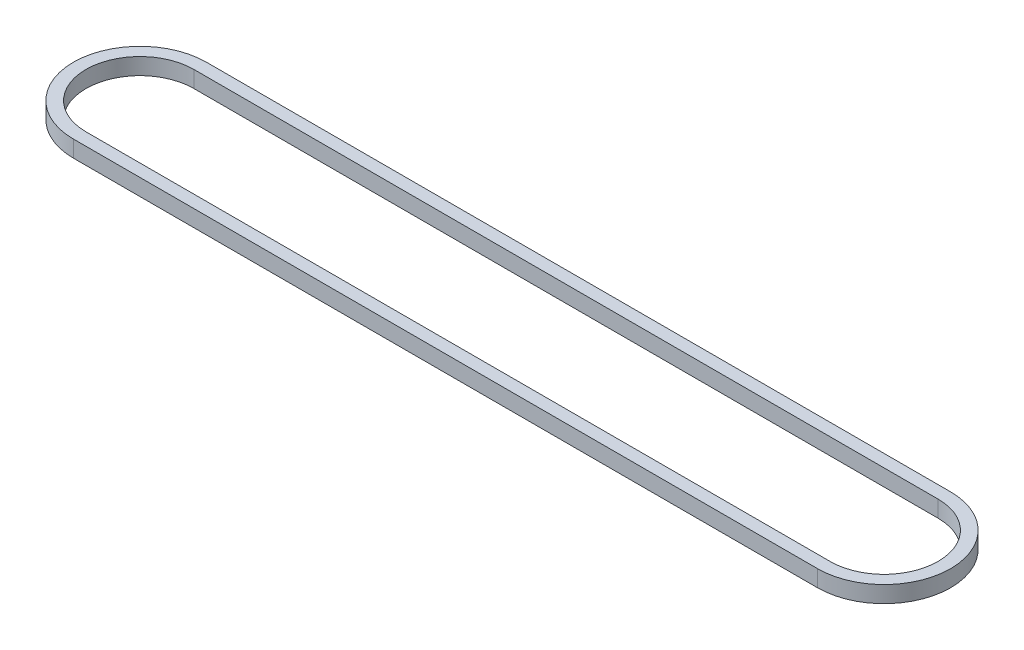
ISO-10303-21;
HEADER;
FILE_DESCRIPTION(('STEP AP214'),'2;1');
FILE_NAME('part.step','',(''),(''),'','','');
FILE_SCHEMA(('AUTOMOTIVE_DESIGN { 1 0 10303 214 1 1 1 1 }'));
ENDSEC;
DATA;
#1=APPLICATION_CONTEXT('core data for automotive mechanical design processes');
#2=APPLICATION_PROTOCOL_DEFINITION('international standard','automotive_design',2000,#1);
#3=PRODUCT_CONTEXT('',#1,'mechanical');
#4=PRODUCT('Part','Part','',(#3));
#5=PRODUCT_RELATED_PRODUCT_CATEGORY('part','',(#4));
#6=PRODUCT_DEFINITION_FORMATION('','',#4);
#7=PRODUCT_DEFINITION_CONTEXT('part definition',#1,'design');
#8=PRODUCT_DEFINITION('design','',#6,#7);
#9=PRODUCT_DEFINITION_SHAPE('','',#8);
#10=(LENGTH_UNIT() NAMED_UNIT(*) SI_UNIT(.MILLI.,.METRE.));
#11=(NAMED_UNIT(*) PLANE_ANGLE_UNIT() SI_UNIT($,.RADIAN.));
#12=(NAMED_UNIT(*) SI_UNIT($,.STERADIAN.) SOLID_ANGLE_UNIT());
#13=UNCERTAINTY_MEASURE_WITH_UNIT(LENGTH_MEASURE(1.E-05),#10,'distance_accuracy_value','');
#14=(GEOMETRIC_REPRESENTATION_CONTEXT(3) GLOBAL_UNCERTAINTY_ASSIGNED_CONTEXT((#13)) GLOBAL_UNIT_ASSIGNED_CONTEXT((#10,
#11,#12)) REPRESENTATION_CONTEXT('',''));
#15=CARTESIAN_POINT('',(0.,0.,0.));
#16=DIRECTION('',(0.,0.,1.));
#17=DIRECTION('',(1.,0.,0.));
#18=AXIS2_PLACEMENT_3D('',#15,#16,#17);
#19=CARTESIAN_POINT('',(-175.,7.7978,0.));
#20=DIRECTION('',(0.,1.,0.));
#21=DIRECTION('',(0.,0.,1.));
#22=AXIS2_PLACEMENT_3D('',#19,#20,#21);
#23=PLANE('',#22);
#24=CARTESIAN_POINT('',(-175.,7.7978,0.));
#25=DIRECTION('',(0.,1.,0.));
#26=DIRECTION('',(0.,0.,1.));
#27=AXIS2_PLACEMENT_3D('',#24,#25,#26);
#28=CIRCLE('',#27,31.28695);
#29=CARTESIAN_POINT('',(-175.,7.7978,-31.28695));
#30=VERTEX_POINT('',#29);
#31=CARTESIAN_POINT('',(-175.,7.7978,31.28695));
#32=VERTEX_POINT('',#31);
#33=EDGE_CURVE('E184',#30,#32,#28,.T.);
#34=ORIENTED_EDGE('',*,*,#33,.T.);
#35=DIRECTION('',(1.,0.,0.));
#36=VECTOR('',#35,1.);
#37=CARTESIAN_POINT('',(-175.,7.7978,31.28695));
#38=LINE('',#37,#36);
#39=CARTESIAN_POINT('',(175.,7.7978,31.2869499999999));
#40=VERTEX_POINT('',#39);
#41=EDGE_CURVE('E187',#32,#40,#38,.T.);
#42=ORIENTED_EDGE('',*,*,#41,.T.);
#43=CARTESIAN_POINT('',(175.,7.7978,0.));
#44=DIRECTION('',(0.,1.,0.));
#45=DIRECTION('',(0.,0.,1.));
#46=AXIS2_PLACEMENT_3D('',#43,#44,#45);
#47=CIRCLE('',#46,31.28695);
#48=CARTESIAN_POINT('',(175.,7.7978,-31.28695));
#49=VERTEX_POINT('',#48);
#50=EDGE_CURVE('E191',#40,#49,#47,.T.);
#51=ORIENTED_EDGE('',*,*,#50,.T.);
#52=DIRECTION('',(1.,0.,0.));
#53=VECTOR('',#52,1.);
#54=CARTESIAN_POINT('',(-175.,7.7978,-31.28695));
#55=LINE('',#54,#53);
#56=EDGE_CURVE('E194',#30,#49,#55,.T.);
#57=ORIENTED_EDGE('',*,*,#56,.F.);
#58=EDGE_LOOP('',(#34,#42,#51,#57));
#59=FACE_BOUND('',#58,.T.);
#60=DIRECTION('',(1.,0.,0.));
#61=VECTOR('',#60,1.);
#62=CARTESIAN_POINT('',(-175.,7.7978,-25.39415));
#63=LINE('',#62,#61);
#64=CARTESIAN_POINT('',(-175.,7.7978,-25.39415));
#65=VERTEX_POINT('',#64);
#66=CARTESIAN_POINT('',(175.,7.7978,-25.3941500000001));
#67=VERTEX_POINT('',#66);
#68=EDGE_CURVE('E149',#65,#67,#63,.T.);
#69=ORIENTED_EDGE('',*,*,#68,.T.);
#70=CARTESIAN_POINT('',(175.,7.7978,0.));
#71=DIRECTION('',(0.,1.,0.));
#72=DIRECTION('',(0.,0.,1.));
#73=AXIS2_PLACEMENT_3D('',#70,#71,#72);
#74=CIRCLE('',#73,25.39415);
#75=CARTESIAN_POINT('',(175.,7.7978,25.39415));
#76=VERTEX_POINT('',#75);
#77=EDGE_CURVE('E139',#76,#67,#74,.T.);
#78=ORIENTED_EDGE('',*,*,#77,.F.);
#79=DIRECTION('',(1.,0.,0.));
#80=VECTOR('',#79,1.);
#81=CARTESIAN_POINT('',(-175.,7.7978,25.39415));
#82=LINE('',#81,#80);
#83=CARTESIAN_POINT('',(-175.,7.7978,25.39415));
#84=VERTEX_POINT('',#83);
#85=EDGE_CURVE('E167',#84,#76,#82,.T.);
#86=ORIENTED_EDGE('',*,*,#85,.F.);
#87=CARTESIAN_POINT('',(-175.,7.7978,0.));
#88=DIRECTION('',(0.,1.,0.));
#89=DIRECTION('',(0.,0.,1.));
#90=AXIS2_PLACEMENT_3D('',#87,#88,#89);
#91=CIRCLE('',#90,25.39415);
#92=EDGE_CURVE('E161',#65,#84,#91,.T.);
#93=ORIENTED_EDGE('',*,*,#92,.F.);
#94=EDGE_LOOP('',(#69,#78,#86,#93));
#95=FACE_BOUND('',#94,.T.);
#96=ADVANCED_FACE('F75',(#59,#95),#23,.T.);
#97=CARTESIAN_POINT('',(-175.,0.,0.));
#98=DIRECTION('',(0.,1.,0.));
#99=DIRECTION('',(0.,0.,1.));
#100=AXIS2_PLACEMENT_3D('',#97,#98,#99);
#101=PLANE('',#100);
#102=CARTESIAN_POINT('',(-175.,0.,0.));
#103=DIRECTION('',(0.,1.,0.));
#104=DIRECTION('',(0.,0.,1.));
#105=AXIS2_PLACEMENT_3D('',#102,#103,#104);
#106=CIRCLE('',#105,31.28695);
#107=CARTESIAN_POINT('',(-175.,0.,-31.28695));
#108=VERTEX_POINT('',#107);
#109=CARTESIAN_POINT('',(-175.,0.,31.28695));
#110=VERTEX_POINT('',#109);
#111=EDGE_CURVE('E158',#108,#110,#106,.T.);
#112=ORIENTED_EDGE('',*,*,#111,.F.);
#113=DIRECTION('',(1.,0.,0.));
#114=VECTOR('',#113,1.);
#115=CARTESIAN_POINT('',(-175.,0.,-31.28695));
#116=LINE('',#115,#114);
#117=CARTESIAN_POINT('',(175.,0.,-31.28695));
#118=VERTEX_POINT('',#117);
#119=EDGE_CURVE('E188',#108,#118,#116,.T.);
#120=ORIENTED_EDGE('',*,*,#119,.T.);
#121=CARTESIAN_POINT('',(175.,0.,0.));
#122=DIRECTION('',(0.,1.,0.));
#123=DIRECTION('',(0.,0.,1.));
#124=AXIS2_PLACEMENT_3D('',#121,#122,#123);
#125=CIRCLE('',#124,31.28695);
#126=CARTESIAN_POINT('',(175.,0.,31.2869499999999));
#127=VERTEX_POINT('',#126);
#128=EDGE_CURVE('E204',#127,#118,#125,.T.);
#129=ORIENTED_EDGE('',*,*,#128,.F.);
#130=DIRECTION('',(1.,0.,0.));
#131=VECTOR('',#130,1.);
#132=CARTESIAN_POINT('',(-175.,0.,31.28695));
#133=LINE('',#132,#131);
#134=EDGE_CURVE('E201',#110,#127,#133,.T.);
#135=ORIENTED_EDGE('',*,*,#134,.F.);
#136=EDGE_LOOP('',(#112,#120,#129,#135));
#137=FACE_BOUND('',#136,.T.);
#138=CARTESIAN_POINT('',(175.,0.,0.));
#139=DIRECTION('',(0.,1.,0.));
#140=DIRECTION('',(0.,0.,1.));
#141=AXIS2_PLACEMENT_3D('',#138,#139,#140);
#142=CIRCLE('',#141,25.39415);
#143=CARTESIAN_POINT('',(175.,0.,25.39415));
#144=VERTEX_POINT('',#143);
#145=CARTESIAN_POINT('',(175.,0.,-25.3941500000001));
#146=VERTEX_POINT('',#145);
#147=EDGE_CURVE('E98',#144,#146,#142,.T.);
#148=ORIENTED_EDGE('',*,*,#147,.T.);
#149=DIRECTION('',(1.,0.,0.));
#150=VECTOR('',#149,1.);
#151=CARTESIAN_POINT('',(-175.,0.,-25.39415));
#152=LINE('',#151,#150);
#153=CARTESIAN_POINT('',(-175.,0.,-25.39415));
#154=VERTEX_POINT('',#153);
#155=EDGE_CURVE('E157',#154,#146,#152,.T.);
#156=ORIENTED_EDGE('',*,*,#155,.F.);
#157=CARTESIAN_POINT('',(-175.,0.,0.));
#158=DIRECTION('',(0.,1.,0.));
#159=DIRECTION('',(0.,0.,1.));
#160=AXIS2_PLACEMENT_3D('',#157,#158,#159);
#161=CIRCLE('',#160,25.39415);
#162=CARTESIAN_POINT('',(-175.,0.,25.39415));
#163=VERTEX_POINT('',#162);
#164=EDGE_CURVE('E175',#154,#163,#161,.T.);
#165=ORIENTED_EDGE('',*,*,#164,.T.);
#166=DIRECTION('',(1.,0.,0.));
#167=VECTOR('',#166,1.);
#168=CARTESIAN_POINT('',(-175.,0.,25.39415));
#169=LINE('',#168,#167);
#170=EDGE_CURVE('E150',#163,#144,#169,.T.);
#171=ORIENTED_EDGE('',*,*,#170,.T.);
#172=EDGE_LOOP('',(#148,#156,#165,#171));
#173=FACE_BOUND('',#172,.T.);
#174=ADVANCED_FACE('F222',(#137,#173),#101,.F.);
#175=CARTESIAN_POINT('',(-175.,7.7978,0.));
#176=DIRECTION('',(0.,-1.,0.));
#177=DIRECTION('',(0.,0.,-1.));
#178=AXIS2_PLACEMENT_3D('',#175,#176,#177);
#179=CYLINDRICAL_SURFACE('',#178,31.28695);
#180=ORIENTED_EDGE('',*,*,#111,.T.);
#181=DIRECTION('',(0.,-1.,0.));
#182=VECTOR('',#181,1.);
#183=CARTESIAN_POINT('',(-175.,7.7978,31.28695));
#184=LINE('',#183,#182);
#185=EDGE_CURVE('E12',#32,#110,#184,.T.);
#186=ORIENTED_EDGE('',*,*,#185,.F.);
#187=ORIENTED_EDGE('',*,*,#33,.F.);
#188=DIRECTION('',(0.,-1.,0.));
#189=VECTOR('',#188,1.);
#190=CARTESIAN_POINT('',(-175.,7.7978,-31.28695));
#191=LINE('',#190,#189);
#192=EDGE_CURVE('E198',#30,#108,#191,.T.);
#193=ORIENTED_EDGE('',*,*,#192,.T.);
#194=EDGE_LOOP('',(#180,#186,#187,#193));
#195=FACE_BOUND('',#194,.T.);
#196=ADVANCED_FACE('F77',(#195),#179,.T.);
#197=CARTESIAN_POINT('',(-175.,7.7978,31.28695));
#198=DIRECTION('',(0.,0.,-1.));
#199=DIRECTION('',(-1.,0.,0.));
#200=AXIS2_PLACEMENT_3D('',#197,#198,#199);
#201=PLANE('',#200);
#202=ORIENTED_EDGE('',*,*,#134,.T.);
#203=DIRECTION('',(0.,-1.,0.));
#204=VECTOR('',#203,1.);
#205=CARTESIAN_POINT('',(175.,7.7978,31.2869499999999));
#206=LINE('',#205,#204);
#207=EDGE_CURVE('E83',#40,#127,#206,.T.);
#208=ORIENTED_EDGE('',*,*,#207,.F.);
#209=ORIENTED_EDGE('',*,*,#41,.F.);
#210=ORIENTED_EDGE('',*,*,#185,.T.);
#211=EDGE_LOOP('',(#202,#208,#209,#210));
#212=FACE_BOUND('',#211,.T.);
#213=ADVANCED_FACE('F231',(#212),#201,.F.);
#214=CARTESIAN_POINT('',(175.,7.7978,0.));
#215=DIRECTION('',(0.,-1.,0.));
#216=DIRECTION('',(0.,0.,-1.));
#217=AXIS2_PLACEMENT_3D('',#214,#215,#216);
#218=CYLINDRICAL_SURFACE('',#217,31.28695);
#219=ORIENTED_EDGE('',*,*,#128,.T.);
#220=DIRECTION('',(0.,-1.,0.));
#221=VECTOR('',#220,1.);
#222=CARTESIAN_POINT('',(175.,7.7978,-31.28695));
#223=LINE('',#222,#221);
#224=EDGE_CURVE('E211',#49,#118,#223,.T.);
#225=ORIENTED_EDGE('',*,*,#224,.F.);
#226=ORIENTED_EDGE('',*,*,#50,.F.);
#227=ORIENTED_EDGE('',*,*,#207,.T.);
#228=EDGE_LOOP('',(#219,#225,#226,#227));
#229=FACE_BOUND('',#228,.T.);
#230=ADVANCED_FACE('F217',(#229),#218,.T.);
#231=CARTESIAN_POINT('',(-175.,7.7978,-31.28695));
#232=DIRECTION('',(0.,0.,-1.));
#233=DIRECTION('',(-1.,0.,0.));
#234=AXIS2_PLACEMENT_3D('',#231,#232,#233);
#235=PLANE('',#234);
#236=ORIENTED_EDGE('',*,*,#119,.F.);
#237=ORIENTED_EDGE('',*,*,#192,.F.);
#238=ORIENTED_EDGE('',*,*,#56,.T.);
#239=ORIENTED_EDGE('',*,*,#224,.T.);
#240=EDGE_LOOP('',(#236,#237,#238,#239));
#241=FACE_BOUND('',#240,.T.);
#242=ADVANCED_FACE('F226',(#241),#235,.T.);
#243=CARTESIAN_POINT('',(175.,7.7978,0.));
#244=DIRECTION('',(0.,-1.,0.));
#245=DIRECTION('',(0.,0.,-1.));
#246=AXIS2_PLACEMENT_3D('',#243,#244,#245);
#247=CYLINDRICAL_SURFACE('',#246,25.39415);
#248=ORIENTED_EDGE('',*,*,#147,.F.);
#249=DIRECTION('',(0.,-1.,0.));
#250=VECTOR('',#249,1.);
#251=CARTESIAN_POINT('',(175.,7.7978,25.39415));
#252=LINE('',#251,#250);
#253=EDGE_CURVE('E144',#76,#144,#252,.T.);
#254=ORIENTED_EDGE('',*,*,#253,.F.);
#255=ORIENTED_EDGE('',*,*,#77,.T.);
#256=DIRECTION('',(0.,-1.,0.));
#257=VECTOR('',#256,1.);
#258=CARTESIAN_POINT('',(175.,7.7978,-25.3941500000001));
#259=LINE('',#258,#257);
#260=EDGE_CURVE('E142',#67,#146,#259,.T.);
#261=ORIENTED_EDGE('',*,*,#260,.T.);
#262=EDGE_LOOP('',(#248,#254,#255,#261));
#263=FACE_BOUND('',#262,.T.);
#264=ADVANCED_FACE('F141',(#263),#247,.F.);
#265=CARTESIAN_POINT('',(-175.,7.7978,-25.39415));
#266=DIRECTION('',(0.,0.,-1.));
#267=DIRECTION('',(-1.,0.,0.));
#268=AXIS2_PLACEMENT_3D('',#265,#266,#267);
#269=PLANE('',#268);
#270=ORIENTED_EDGE('',*,*,#155,.T.);
#271=ORIENTED_EDGE('',*,*,#260,.F.);
#272=ORIENTED_EDGE('',*,*,#68,.F.);
#273=DIRECTION('',(0.,-1.,0.));
#274=VECTOR('',#273,1.);
#275=CARTESIAN_POINT('',(-175.,7.7978,-25.39415));
#276=LINE('',#275,#274);
#277=EDGE_CURVE('E159',#65,#154,#276,.T.);
#278=ORIENTED_EDGE('',*,*,#277,.T.);
#279=EDGE_LOOP('',(#270,#271,#272,#278));
#280=FACE_BOUND('',#279,.T.);
#281=ADVANCED_FACE('F154',(#280),#269,.F.);
#282=CARTESIAN_POINT('',(-175.,7.7978,0.));
#283=DIRECTION('',(0.,-1.,0.));
#284=DIRECTION('',(0.,0.,-1.));
#285=AXIS2_PLACEMENT_3D('',#282,#283,#284);
#286=CYLINDRICAL_SURFACE('',#285,25.39415);
#287=ORIENTED_EDGE('',*,*,#164,.F.);
#288=ORIENTED_EDGE('',*,*,#277,.F.);
#289=ORIENTED_EDGE('',*,*,#92,.T.);
#290=DIRECTION('',(0.,-1.,0.));
#291=VECTOR('',#290,1.);
#292=CARTESIAN_POINT('',(-175.,7.7978,25.39415));
#293=LINE('',#292,#291);
#294=EDGE_CURVE('E90',#84,#163,#293,.T.);
#295=ORIENTED_EDGE('',*,*,#294,.T.);
#296=EDGE_LOOP('',(#287,#288,#289,#295));
#297=FACE_BOUND('',#296,.T.);
#298=ADVANCED_FACE('F267',(#297),#286,.F.);
#299=CARTESIAN_POINT('',(-175.,7.7978,25.39415));
#300=DIRECTION('',(0.,0.,-1.));
#301=DIRECTION('',(-1.,0.,0.));
#302=AXIS2_PLACEMENT_3D('',#299,#300,#301);
#303=PLANE('',#302);
#304=ORIENTED_EDGE('',*,*,#170,.F.);
#305=ORIENTED_EDGE('',*,*,#294,.F.);
#306=ORIENTED_EDGE('',*,*,#85,.T.);
#307=ORIENTED_EDGE('',*,*,#253,.T.);
#308=EDGE_LOOP('',(#304,#305,#306,#307));
#309=FACE_BOUND('',#308,.T.);
#310=ADVANCED_FACE('F272',(#309),#303,.T.);
#311=CLOSED_SHELL('',(#96,#174,#196,#213,#230,#242,#264,#281,#298,#310));
#312=MANIFOLD_SOLID_BREP('B2',#311);
#313=ADVANCED_BREP_SHAPE_REPRESENTATION('',(#18,#312),#14);
#314=SHAPE_DEFINITION_REPRESENTATION(#9,#313);
ENDSEC;
END-ISO-10303-21;
